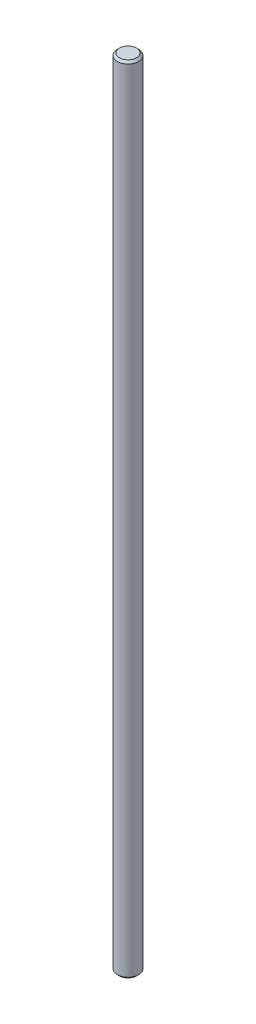
ISO-10303-21;
HEADER;
FILE_DESCRIPTION(('STEP AP214'),'2;1');
FILE_NAME('part.step','',(''),(''),'','','');
FILE_SCHEMA(('AUTOMOTIVE_DESIGN { 1 0 10303 214 1 1 1 1 }'));
ENDSEC;
DATA;
#1=APPLICATION_CONTEXT('core data for automotive mechanical design processes');
#2=APPLICATION_PROTOCOL_DEFINITION('international standard','automotive_design',2000,#1);
#3=PRODUCT_CONTEXT('',#1,'mechanical');
#4=PRODUCT('Part','Part','',(#3));
#5=PRODUCT_RELATED_PRODUCT_CATEGORY('part','',(#4));
#6=PRODUCT_DEFINITION_FORMATION('','',#4);
#7=PRODUCT_DEFINITION_CONTEXT('part definition',#1,'design');
#8=PRODUCT_DEFINITION('design','',#6,#7);
#9=PRODUCT_DEFINITION_SHAPE('','',#8);
#10=(LENGTH_UNIT() NAMED_UNIT(*) SI_UNIT(.MILLI.,.METRE.));
#11=(NAMED_UNIT(*) PLANE_ANGLE_UNIT() SI_UNIT($,.RADIAN.));
#12=(NAMED_UNIT(*) SI_UNIT($,.STERADIAN.) SOLID_ANGLE_UNIT());
#13=UNCERTAINTY_MEASURE_WITH_UNIT(LENGTH_MEASURE(1.E-05),#10,'distance_accuracy_value','');
#14=(GEOMETRIC_REPRESENTATION_CONTEXT(3) GLOBAL_UNCERTAINTY_ASSIGNED_CONTEXT((#13)) GLOBAL_UNIT_ASSIGNED_CONTEXT((#10,
#11,#12)) REPRESENTATION_CONTEXT('',''));
#15=CARTESIAN_POINT('',(0.,0.,0.));
#16=DIRECTION('',(0.,0.,1.));
#17=DIRECTION('',(1.,0.,0.));
#18=AXIS2_PLACEMENT_3D('',#15,#16,#17);
#19=CARTESIAN_POINT('',(0.,375.,0.));
#20=DIRECTION('',(0.,-1.,0.));
#21=DIRECTION('',(0.,0.,-1.));
#22=AXIS2_PLACEMENT_3D('',#19,#20,#21);
#23=CYLINDRICAL_SURFACE('',#22,5.);
#24=CARTESIAN_POINT('',(0.,374.,0.));
#25=DIRECTION('',(0.,1.,0.));
#26=DIRECTION('',(0.,0.,1.));
#27=AXIS2_PLACEMENT_3D('',#24,#25,#26);
#28=CIRCLE('',#27,5.);
#29=CARTESIAN_POINT('',(0.,374.,5.));
#30=VERTEX_POINT('',#29);
#31=EDGE_CURVE('E51',#30,#30,#28,.F.);
#32=ORIENTED_EDGE('',*,*,#31,.T.);
#33=EDGE_LOOP('',(#32));
#34=FACE_BOUND('',#33,.T.);
#35=CARTESIAN_POINT('',(0.,1.,0.));
#36=DIRECTION('',(0.,1.,0.));
#37=DIRECTION('',(0.,0.,1.));
#38=AXIS2_PLACEMENT_3D('',#35,#36,#37);
#39=CIRCLE('',#38,5.);
#40=CARTESIAN_POINT('',(0.,1.,5.));
#41=VERTEX_POINT('',#40);
#42=EDGE_CURVE('E55',#41,#41,#39,.T.);
#43=ORIENTED_EDGE('',*,*,#42,.T.);
#44=EDGE_LOOP('',(#43));
#45=FACE_BOUND('',#44,.T.);
#46=ADVANCED_FACE('F43',(#34,#45),#23,.T.);
#47=CARTESIAN_POINT('',(0.,375.,0.));
#48=DIRECTION('',(0.,1.,0.));
#49=DIRECTION('',(0.,0.,1.));
#50=AXIS2_PLACEMENT_3D('',#47,#48,#49);
#51=PLANE('',#50);
#52=CARTESIAN_POINT('',(0.,375.,0.));
#53=DIRECTION('',(0.,1.,0.));
#54=DIRECTION('',(0.,0.,1.));
#55=AXIS2_PLACEMENT_3D('',#52,#53,#54);
#56=CIRCLE('',#55,4.00000000000006);
#57=CARTESIAN_POINT('',(0.,375.,4.00000000000006));
#58=VERTEX_POINT('',#57);
#59=EDGE_CURVE('E59',#58,#58,#56,.T.);
#60=ORIENTED_EDGE('',*,*,#59,.T.);
#61=EDGE_LOOP('',(#60));
#62=FACE_BOUND('',#61,.T.);
#63=ADVANCED_FACE('F65',(#62),#51,.T.);
#64=CARTESIAN_POINT('',(0.,0.,0.));
#65=DIRECTION('',(0.,1.,0.));
#66=DIRECTION('',(0.,0.,1.));
#67=AXIS2_PLACEMENT_3D('',#64,#65,#66);
#68=PLANE('',#67);
#69=CARTESIAN_POINT('',(0.,0.,0.));
#70=DIRECTION('',(0.,1.,0.));
#71=DIRECTION('',(0.,0.,1.));
#72=AXIS2_PLACEMENT_3D('',#69,#70,#71);
#73=CIRCLE('',#72,4.00000000000006);
#74=CARTESIAN_POINT('',(0.,0.,4.00000000000006));
#75=VERTEX_POINT('',#74);
#76=EDGE_CURVE('E10',#75,#75,#73,.F.);
#77=ORIENTED_EDGE('',*,*,#76,.T.);
#78=EDGE_LOOP('',(#77));
#79=FACE_BOUND('',#78,.T.);
#80=ADVANCED_FACE('F69',(#79),#68,.F.);
#81=CARTESIAN_POINT('',(0.,375.,0.));
#82=DIRECTION('',(0.,-1.,0.));
#83=DIRECTION('',(0.,0.,-1.));
#84=AXIS2_PLACEMENT_3D('',#81,#82,#83);
#85=CONICAL_SURFACE('',#84,4.00000000000006,0.785398163397446);
#86=ORIENTED_EDGE('',*,*,#31,.F.);
#87=EDGE_LOOP('',(#86));
#88=FACE_BOUND('',#87,.T.);
#89=ORIENTED_EDGE('',*,*,#59,.F.);
#90=EDGE_LOOP('',(#89));
#91=FACE_BOUND('',#90,.T.);
#92=ADVANCED_FACE('F67',(#88,#91),#85,.T.);
#93=CARTESIAN_POINT('',(0.,1.,0.));
#94=DIRECTION('',(0.,1.,0.));
#95=DIRECTION('',(0.,0.,1.));
#96=AXIS2_PLACEMENT_3D('',#93,#94,#95);
#97=CONICAL_SURFACE('',#96,5.,0.785398163397418);
#98=ORIENTED_EDGE('',*,*,#76,.F.);
#99=EDGE_LOOP('',(#98));
#100=FACE_BOUND('',#99,.T.);
#101=ORIENTED_EDGE('',*,*,#42,.F.);
#102=EDGE_LOOP('',(#101));
#103=FACE_BOUND('',#102,.T.);
#104=ADVANCED_FACE('F46',(#100,#103),#97,.T.);
#105=CLOSED_SHELL('',(#46,#63,#80,#92,#104));
#106=MANIFOLD_SOLID_BREP('B2',#105);
#107=ADVANCED_BREP_SHAPE_REPRESENTATION('',(#18,#106),#14);
#108=SHAPE_DEFINITION_REPRESENTATION(#9,#107);
ENDSEC;
END-ISO-10303-21;
